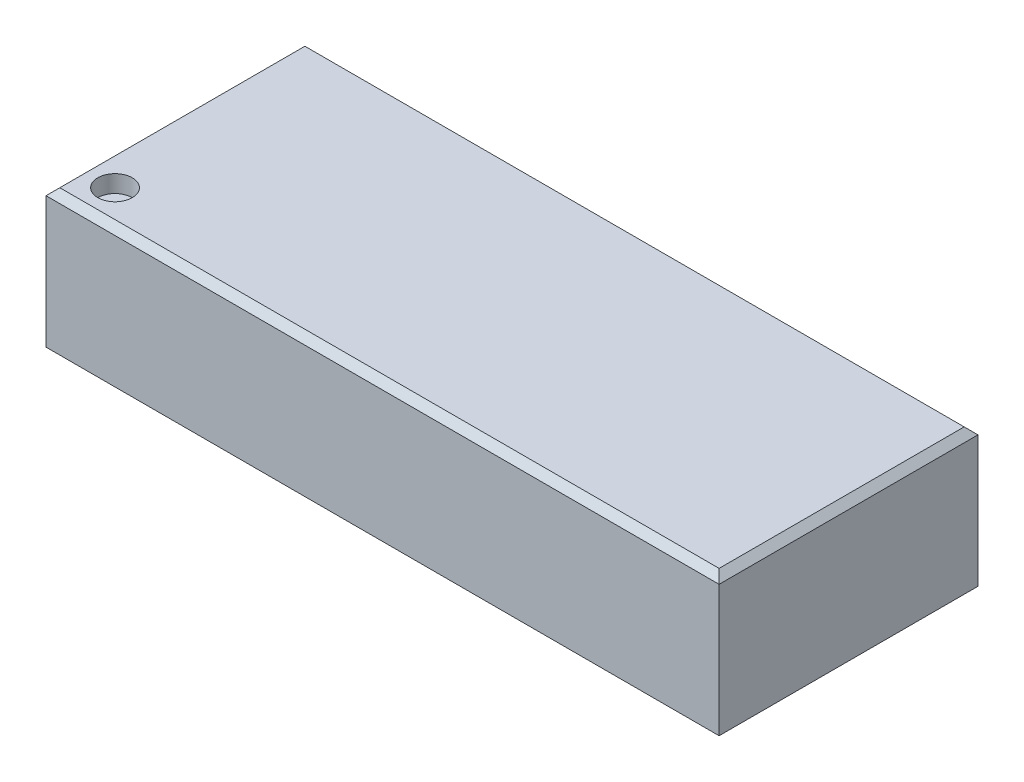
ISO-10303-21;
HEADER;
FILE_DESCRIPTION(('STEP AP214'),'2;1');
FILE_NAME('part.step','',(''),(''),'','','');
FILE_SCHEMA(('AUTOMOTIVE_DESIGN { 1 0 10303 214 1 1 1 1 }'));
ENDSEC;
DATA;
#1=APPLICATION_CONTEXT('core data for automotive mechanical design processes');
#2=APPLICATION_PROTOCOL_DEFINITION('international standard','automotive_design',2000,#1);
#3=PRODUCT_CONTEXT('',#1,'mechanical');
#4=PRODUCT('Part','Part','',(#3));
#5=PRODUCT_RELATED_PRODUCT_CATEGORY('part','',(#4));
#6=PRODUCT_DEFINITION_FORMATION('','',#4);
#7=PRODUCT_DEFINITION_CONTEXT('part definition',#1,'design');
#8=PRODUCT_DEFINITION('design','',#6,#7);
#9=PRODUCT_DEFINITION_SHAPE('','',#8);
#10=(LENGTH_UNIT() NAMED_UNIT(*) SI_UNIT(.MILLI.,.METRE.));
#11=(NAMED_UNIT(*) PLANE_ANGLE_UNIT() SI_UNIT($,.RADIAN.));
#12=(NAMED_UNIT(*) SI_UNIT($,.STERADIAN.) SOLID_ANGLE_UNIT());
#13=UNCERTAINTY_MEASURE_WITH_UNIT(LENGTH_MEASURE(1.E-05),#10,'distance_accuracy_value','');
#14=(GEOMETRIC_REPRESENTATION_CONTEXT(3) GLOBAL_UNCERTAINTY_ASSIGNED_CONTEXT((#13)) GLOBAL_UNIT_ASSIGNED_CONTEXT((#10,
#11,#12)) REPRESENTATION_CONTEXT('',''));
#15=CARTESIAN_POINT('',(0.,0.,0.));
#16=DIRECTION('',(0.,0.,1.));
#17=DIRECTION('',(1.,0.,0.));
#18=AXIS2_PLACEMENT_3D('',#15,#16,#17);
#19=CARTESIAN_POINT('',(-4.875,2.,-1.875));
#20=DIRECTION('',(1.,0.,0.));
#21=DIRECTION('',(0.,0.,-1.));
#22=AXIS2_PLACEMENT_3D('',#19,#20,#21);
#23=PLANE('',#22);
#24=DIRECTION('',(0.,-1.,0.));
#25=VECTOR('',#24,1.);
#26=CARTESIAN_POINT('',(-4.875,2.,1.875));
#27=LINE('',#26,#25);
#28=CARTESIAN_POINT('',(-4.875,1.9,1.875));
#29=VERTEX_POINT('',#28);
#30=CARTESIAN_POINT('',(-4.875,0.,1.875));
#31=VERTEX_POINT('',#30);
#32=EDGE_CURVE('E86',#29,#31,#27,.T.);
#33=ORIENTED_EDGE('',*,*,#32,.F.);
#34=DIRECTION('',(0.,0.,-1.));
#35=VECTOR('',#34,1.);
#36=CARTESIAN_POINT('',(-4.875,1.9,-1.875));
#37=LINE('',#36,#35);
#38=CARTESIAN_POINT('',(-4.875,1.9,-1.875));
#39=VERTEX_POINT('',#38);
#40=EDGE_CURVE('E11',#29,#39,#37,.T.);
#41=ORIENTED_EDGE('',*,*,#40,.T.);
#42=DIRECTION('',(0.,-1.,0.));
#43=VECTOR('',#42,1.);
#44=CARTESIAN_POINT('',(-4.875,2.,-1.875));
#45=LINE('',#44,#43);
#46=CARTESIAN_POINT('',(-4.875,0.,-1.875));
#47=VERTEX_POINT('',#46);
#48=EDGE_CURVE('E103',#39,#47,#45,.T.);
#49=ORIENTED_EDGE('',*,*,#48,.T.);
#50=DIRECTION('',(0.,0.,1.));
#51=VECTOR('',#50,1.);
#52=CARTESIAN_POINT('',(-4.875,0.,-1.875));
#53=LINE('',#52,#51);
#54=EDGE_CURVE('E99',#47,#31,#53,.T.);
#55=ORIENTED_EDGE('',*,*,#54,.T.);
#56=EDGE_LOOP('',(#33,#41,#49,#55));
#57=FACE_BOUND('',#56,.T.);
#58=ADVANCED_FACE('F34',(#57),#23,.F.);
#59=CARTESIAN_POINT('',(-4.875,2.,1.875));
#60=DIRECTION('',(0.,0.,-1.));
#61=DIRECTION('',(-1.,0.,0.));
#62=AXIS2_PLACEMENT_3D('',#59,#60,#61);
#63=PLANE('',#62);
#64=DIRECTION('',(0.,-1.,0.));
#65=VECTOR('',#64,1.);
#66=CARTESIAN_POINT('',(4.875,2.,1.875));
#67=LINE('',#66,#65);
#68=CARTESIAN_POINT('',(4.875,1.9,1.875));
#69=VERTEX_POINT('',#68);
#70=CARTESIAN_POINT('',(4.875,0.,1.875));
#71=VERTEX_POINT('',#70);
#72=EDGE_CURVE('E93',#69,#71,#67,.T.);
#73=ORIENTED_EDGE('',*,*,#72,.F.);
#74=DIRECTION('',(-1.,0.,0.));
#75=VECTOR('',#74,1.);
#76=CARTESIAN_POINT('',(-4.875,1.9,1.875));
#77=LINE('',#76,#75);
#78=EDGE_CURVE('E57',#69,#29,#77,.T.);
#79=ORIENTED_EDGE('',*,*,#78,.T.);
#80=ORIENTED_EDGE('',*,*,#32,.T.);
#81=DIRECTION('',(1.,0.,0.));
#82=VECTOR('',#81,1.);
#83=CARTESIAN_POINT('',(-4.875,0.,1.875));
#84=LINE('',#83,#82);
#85=EDGE_CURVE('E89',#31,#71,#84,.T.);
#86=ORIENTED_EDGE('',*,*,#85,.T.);
#87=EDGE_LOOP('',(#73,#79,#80,#86));
#88=FACE_BOUND('',#87,.T.);
#89=ADVANCED_FACE('F88',(#88),#63,.F.);
#90=CARTESIAN_POINT('',(4.875,2.,-1.875));
#91=DIRECTION('',(-1.,0.,0.));
#92=DIRECTION('',(0.,0.,1.));
#93=AXIS2_PLACEMENT_3D('',#90,#91,#92);
#94=PLANE('',#93);
#95=DIRECTION('',(0.,-1.,0.));
#96=VECTOR('',#95,1.);
#97=CARTESIAN_POINT('',(4.875,2.,-1.875));
#98=LINE('',#97,#96);
#99=CARTESIAN_POINT('',(4.875,1.9,-1.875));
#100=VERTEX_POINT('',#99);
#101=CARTESIAN_POINT('',(4.875,0.,-1.875));
#102=VERTEX_POINT('',#101);
#103=EDGE_CURVE('E116',#100,#102,#98,.T.);
#104=ORIENTED_EDGE('',*,*,#103,.F.);
#105=DIRECTION('',(0.,0.,1.));
#106=VECTOR('',#105,1.);
#107=CARTESIAN_POINT('',(4.875,1.9,1.875));
#108=LINE('',#107,#106);
#109=EDGE_CURVE('E127',#100,#69,#108,.T.);
#110=ORIENTED_EDGE('',*,*,#109,.T.);
#111=ORIENTED_EDGE('',*,*,#72,.T.);
#112=DIRECTION('',(0.,0.,-1.));
#113=VECTOR('',#112,1.);
#114=CARTESIAN_POINT('',(4.875,0.,-1.875));
#115=LINE('',#114,#113);
#116=EDGE_CURVE('E101',#71,#102,#115,.T.);
#117=ORIENTED_EDGE('',*,*,#116,.T.);
#118=EDGE_LOOP('',(#104,#110,#111,#117));
#119=FACE_BOUND('',#118,.T.);
#120=ADVANCED_FACE('F160',(#119),#94,.F.);
#121=CARTESIAN_POINT('',(-4.875,2.,-1.875));
#122=DIRECTION('',(0.,0.,1.));
#123=DIRECTION('',(1.,0.,0.));
#124=AXIS2_PLACEMENT_3D('',#121,#122,#123);
#125=PLANE('',#124);
#126=ORIENTED_EDGE('',*,*,#48,.F.);
#127=DIRECTION('',(1.,0.,0.));
#128=VECTOR('',#127,1.);
#129=CARTESIAN_POINT('',(4.875,1.9,-1.875));
#130=LINE('',#129,#128);
#131=EDGE_CURVE('E43',#39,#100,#130,.T.);
#132=ORIENTED_EDGE('',*,*,#131,.T.);
#133=ORIENTED_EDGE('',*,*,#103,.T.);
#134=DIRECTION('',(-1.,0.,0.));
#135=VECTOR('',#134,1.);
#136=CARTESIAN_POINT('',(-4.875,0.,-1.875));
#137=LINE('',#136,#135);
#138=EDGE_CURVE('E113',#102,#47,#137,.T.);
#139=ORIENTED_EDGE('',*,*,#138,.T.);
#140=EDGE_LOOP('',(#126,#132,#133,#139));
#141=FACE_BOUND('',#140,.T.);
#142=ADVANCED_FACE('F152',(#141),#125,.F.);
#143=CARTESIAN_POINT('',(0.,2.,0.));
#144=DIRECTION('',(0.,1.,0.));
#145=DIRECTION('',(0.,0.,1.));
#146=AXIS2_PLACEMENT_3D('',#143,#144,#145);
#147=PLANE('',#146);
#148=DIRECTION('',(1.,0.,0.));
#149=VECTOR('',#148,1.);
#150=CARTESIAN_POINT('',(4.875,2.,1.775));
#151=LINE('',#150,#149);
#152=CARTESIAN_POINT('',(-4.775,2.,1.775));
#153=VERTEX_POINT('',#152);
#154=CARTESIAN_POINT('',(4.775,2.,1.775));
#155=VERTEX_POINT('',#154);
#156=EDGE_CURVE('E122',#153,#155,#151,.T.);
#157=ORIENTED_EDGE('',*,*,#156,.T.);
#158=DIRECTION('',(0.,0.,-1.));
#159=VECTOR('',#158,1.);
#160=CARTESIAN_POINT('',(4.775,2.,-1.875));
#161=LINE('',#160,#159);
#162=CARTESIAN_POINT('',(4.775,2.,-1.775));
#163=VERTEX_POINT('',#162);
#164=EDGE_CURVE('E124',#155,#163,#161,.T.);
#165=ORIENTED_EDGE('',*,*,#164,.T.);
#166=DIRECTION('',(-1.,0.,0.));
#167=VECTOR('',#166,1.);
#168=CARTESIAN_POINT('',(-4.875,2.,-1.775));
#169=LINE('',#168,#167);
#170=CARTESIAN_POINT('',(-4.775,2.,-1.775));
#171=VERTEX_POINT('',#170);
#172=EDGE_CURVE('E120',#163,#171,#169,.T.);
#173=ORIENTED_EDGE('',*,*,#172,.T.);
#174=DIRECTION('',(0.,0.,1.));
#175=VECTOR('',#174,1.);
#176=CARTESIAN_POINT('',(-4.775,2.,1.875));
#177=LINE('',#176,#175);
#178=EDGE_CURVE('E92',#171,#153,#177,.T.);
#179=ORIENTED_EDGE('',*,*,#178,.T.);
#180=EDGE_LOOP('',(#157,#165,#173,#179));
#181=FACE_BOUND('',#180,.T.);
#182=CARTESIAN_POINT('',(-4.375,2.,1.375));
#183=DIRECTION('',(0.,1.,0.));
#184=DIRECTION('',(0.,0.,1.));
#185=AXIS2_PLACEMENT_3D('',#182,#183,#184);
#186=CIRCLE('',#185,0.25);
#187=CARTESIAN_POINT('',(-4.375,2.,1.625));
#188=VERTEX_POINT('',#187);
#189=EDGE_CURVE('E108',#188,#188,#186,.T.);
#190=ORIENTED_EDGE('',*,*,#189,.F.);
#191=EDGE_LOOP('',(#190));
#192=FACE_BOUND('',#191,.T.);
#193=ADVANCED_FACE('F150',(#181,#192),#147,.T.);
#194=CARTESIAN_POINT('',(0.,0.,0.));
#195=DIRECTION('',(0.,1.,0.));
#196=DIRECTION('',(0.,0.,1.));
#197=AXIS2_PLACEMENT_3D('',#194,#195,#196);
#198=PLANE('',#197);
#199=ORIENTED_EDGE('',*,*,#54,.F.);
#200=ORIENTED_EDGE('',*,*,#138,.F.);
#201=ORIENTED_EDGE('',*,*,#116,.F.);
#202=ORIENTED_EDGE('',*,*,#85,.F.);
#203=EDGE_LOOP('',(#199,#200,#201,#202));
#204=FACE_BOUND('',#203,.T.);
#205=ADVANCED_FACE('F97',(#204),#198,.F.);
#206=CARTESIAN_POINT('',(-4.375,1.75,1.375));
#207=DIRECTION('',(0.,1.,0.));
#208=DIRECTION('',(0.,0.,1.));
#209=AXIS2_PLACEMENT_3D('',#206,#207,#208);
#210=CYLINDRICAL_SURFACE('',#209,0.25);
#211=CARTESIAN_POINT('',(-4.375,1.75,1.375));
#212=DIRECTION('',(0.,1.,0.));
#213=DIRECTION('',(0.,0.,1.));
#214=AXIS2_PLACEMENT_3D('',#211,#212,#213);
#215=CIRCLE('',#214,0.25);
#216=CARTESIAN_POINT('',(-4.375,1.75,1.625));
#217=VERTEX_POINT('',#216);
#218=EDGE_CURVE('E105',#217,#217,#215,.T.);
#219=ORIENTED_EDGE('',*,*,#218,.F.);
#220=EDGE_LOOP('',(#219));
#221=FACE_BOUND('',#220,.T.);
#222=ORIENTED_EDGE('',*,*,#189,.T.);
#223=EDGE_LOOP('',(#222));
#224=FACE_BOUND('',#223,.T.);
#225=ADVANCED_FACE('F148',(#221,#224),#210,.F.);
#226=CARTESIAN_POINT('',(-4.375,1.75,1.375));
#227=DIRECTION('',(0.,1.,0.));
#228=DIRECTION('',(0.,0.,1.));
#229=AXIS2_PLACEMENT_3D('',#226,#227,#228);
#230=PLANE('',#229);
#231=ORIENTED_EDGE('',*,*,#218,.T.);
#232=EDGE_LOOP('',(#231));
#233=FACE_BOUND('',#232,.T.);
#234=ADVANCED_FACE('F183',(#233),#230,.T.);
#235=CARTESIAN_POINT('',(-4.775,2.,0.));
#236=DIRECTION('',(-0.707106781186547,0.707106781186547,0.));
#237=DIRECTION('',(0.,0.,-1.));
#238=AXIS2_PLACEMENT_3D('',#235,#236,#237);
#239=PLANE('',#238);
#240=DIRECTION('',(-0.577350269189626,-0.577350269189626,-0.577350269189626));
#241=VECTOR('',#240,1.);
#242=CARTESIAN_POINT('',(-4.18333333333333,2.59166666666667,-1.18333333333333));
#243=LINE('',#242,#241);
#244=EDGE_CURVE('E135',#39,#171,#243,.F.);
#245=ORIENTED_EDGE('',*,*,#244,.F.);
#246=ORIENTED_EDGE('',*,*,#40,.F.);
#247=DIRECTION('',(0.577350269189626,0.577350269189626,-0.577350269189626));
#248=VECTOR('',#247,1.);
#249=CARTESIAN_POINT('',(-4.18333333333333,2.59166666666667,1.18333333333333));
#250=LINE('',#249,#248);
#251=EDGE_CURVE('E38',#153,#29,#250,.F.);
#252=ORIENTED_EDGE('',*,*,#251,.F.);
#253=ORIENTED_EDGE('',*,*,#178,.F.);
#254=EDGE_LOOP('',(#245,#246,#252,#253));
#255=FACE_BOUND('',#254,.T.);
#256=ADVANCED_FACE('F36',(#255),#239,.T.);
#257=CARTESIAN_POINT('',(0.,2.,1.775));
#258=DIRECTION('',(0.,0.707106781186547,0.707106781186547));
#259=DIRECTION('',(-1.,0.,0.));
#260=AXIS2_PLACEMENT_3D('',#257,#258,#259);
#261=PLANE('',#260);
#262=ORIENTED_EDGE('',*,*,#251,.T.);
#263=ORIENTED_EDGE('',*,*,#78,.F.);
#264=DIRECTION('',(-0.577350269189626,0.577350269189626,-0.577350269189626));
#265=VECTOR('',#264,1.);
#266=CARTESIAN_POINT('',(3.18333333333333,3.59166666666667,0.183333333333332));
#267=LINE('',#266,#265);
#268=EDGE_CURVE('E134',#155,#69,#267,.F.);
#269=ORIENTED_EDGE('',*,*,#268,.F.);
#270=ORIENTED_EDGE('',*,*,#156,.F.);
#271=EDGE_LOOP('',(#262,#263,#269,#270));
#272=FACE_BOUND('',#271,.T.);
#273=ADVANCED_FACE('F178',(#272),#261,.T.);
#274=CARTESIAN_POINT('',(0.,2.,-1.775));
#275=DIRECTION('',(0.,0.707106781186547,-0.707106781186547));
#276=DIRECTION('',(1.,0.,0.));
#277=AXIS2_PLACEMENT_3D('',#274,#275,#276);
#278=PLANE('',#277);
#279=ORIENTED_EDGE('',*,*,#244,.T.);
#280=ORIENTED_EDGE('',*,*,#172,.F.);
#281=DIRECTION('',(0.577350269189626,-0.577350269189626,-0.577350269189626));
#282=VECTOR('',#281,1.);
#283=CARTESIAN_POINT('',(3.18333333333333,3.59166666666667,-0.183333333333335));
#284=LINE('',#283,#282);
#285=EDGE_CURVE('E132',#100,#163,#284,.F.);
#286=ORIENTED_EDGE('',*,*,#285,.F.);
#287=ORIENTED_EDGE('',*,*,#131,.F.);
#288=EDGE_LOOP('',(#279,#280,#286,#287));
#289=FACE_BOUND('',#288,.T.);
#290=ADVANCED_FACE('F175',(#289),#278,.T.);
#291=CARTESIAN_POINT('',(4.775,2.,0.));
#292=DIRECTION('',(0.707106781186547,0.707106781186547,0.));
#293=DIRECTION('',(0.,0.,1.));
#294=AXIS2_PLACEMENT_3D('',#291,#292,#293);
#295=PLANE('',#294);
#296=ORIENTED_EDGE('',*,*,#268,.T.);
#297=ORIENTED_EDGE('',*,*,#109,.F.);
#298=ORIENTED_EDGE('',*,*,#285,.T.);
#299=ORIENTED_EDGE('',*,*,#164,.F.);
#300=EDGE_LOOP('',(#296,#297,#298,#299));
#301=FACE_BOUND('',#300,.T.);
#302=ADVANCED_FACE('F172',(#301),#295,.T.);
#303=CLOSED_SHELL('',(#58,#89,#120,#142,#193,#205,#225,#234,#256,#273,#290,#302));
#304=MANIFOLD_SOLID_BREP('B2',#303);
#305=ADVANCED_BREP_SHAPE_REPRESENTATION('',(#18,#304),#14);
#306=SHAPE_DEFINITION_REPRESENTATION(#9,#305);
ENDSEC;
END-ISO-10303-21;
